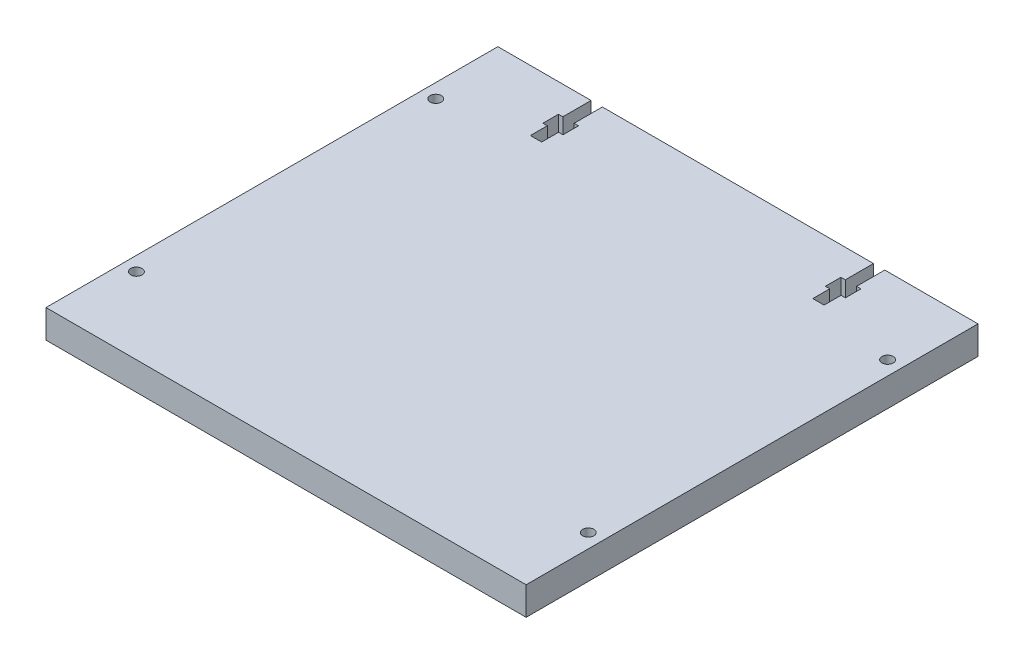
ISO-10303-21;
HEADER;
FILE_DESCRIPTION(('STEP AP214'),'2;1');
FILE_NAME('part.step','',(''),(''),'','','');
FILE_SCHEMA(('AUTOMOTIVE_DESIGN { 1 0 10303 214 1 1 1 1 }'));
ENDSEC;
DATA;
#1=APPLICATION_CONTEXT('core data for automotive mechanical design processes');
#2=APPLICATION_PROTOCOL_DEFINITION('international standard','automotive_design',2000,#1);
#3=PRODUCT_CONTEXT('',#1,'mechanical');
#4=PRODUCT('Part','Part','',(#3));
#5=PRODUCT_RELATED_PRODUCT_CATEGORY('part','',(#4));
#6=PRODUCT_DEFINITION_FORMATION('','',#4);
#7=PRODUCT_DEFINITION_CONTEXT('part definition',#1,'design');
#8=PRODUCT_DEFINITION('design','',#6,#7);
#9=PRODUCT_DEFINITION_SHAPE('','',#8);
#10=(LENGTH_UNIT() NAMED_UNIT(*) SI_UNIT(.MILLI.,.METRE.));
#11=(NAMED_UNIT(*) PLANE_ANGLE_UNIT() SI_UNIT($,.RADIAN.));
#12=(NAMED_UNIT(*) SI_UNIT($,.STERADIAN.) SOLID_ANGLE_UNIT());
#13=UNCERTAINTY_MEASURE_WITH_UNIT(LENGTH_MEASURE(1.E-05),#10,'distance_accuracy_value','');
#14=(GEOMETRIC_REPRESENTATION_CONTEXT(3) GLOBAL_UNCERTAINTY_ASSIGNED_CONTEXT((#13)) GLOBAL_UNIT_ASSIGNED_CONTEXT((#10,
#11,#12)) REPRESENTATION_CONTEXT('',''));
#15=CARTESIAN_POINT('',(0.,0.,0.));
#16=DIRECTION('',(0.,0.,1.));
#17=DIRECTION('',(1.,0.,0.));
#18=AXIS2_PLACEMENT_3D('',#15,#16,#17);
#19=CARTESIAN_POINT('',(0.,0.,160.));
#20=DIRECTION('',(0.,1.,0.));
#21=DIRECTION('',(0.,0.,1.));
#22=AXIS2_PLACEMENT_3D('',#19,#20,#21);
#23=PLANE('',#22);
#24=DIRECTION('',(1.,0.,0.));
#25=VECTOR('',#24,1.);
#26=CARTESIAN_POINT('',(0.,0.,10.));
#27=LINE('',#26,#25);
#28=CARTESIAN_POINT('',(137.,0.,10.));
#29=VERTEX_POINT('',#28);
#30=CARTESIAN_POINT('',(138.55,0.,10.));
#31=VERTEX_POINT('',#30);
#32=EDGE_CURVE('E291',#29,#31,#27,.T.);
#33=ORIENTED_EDGE('',*,*,#32,.F.);
#34=DIRECTION('',(0.,0.,1.));
#35=VECTOR('',#34,1.);
#36=CARTESIAN_POINT('',(137.,0.,0.));
#37=LINE('',#36,#35);
#38=CARTESIAN_POINT('',(137.,0.,0.));
#39=VERTEX_POINT('',#38);
#40=EDGE_CURVE('E288',#39,#29,#37,.T.);
#41=ORIENTED_EDGE('',*,*,#40,.F.);
#42=DIRECTION('',(1.,0.,0.));
#43=VECTOR('',#42,1.);
#44=CARTESIAN_POINT('',(0.,0.,0.));
#45=LINE('',#44,#43);
#46=CARTESIAN_POINT('',(170.,0.,0.));
#47=VERTEX_POINT('',#46);
#48=EDGE_CURVE('E437',#39,#47,#45,.T.);
#49=ORIENTED_EDGE('',*,*,#48,.T.);
#50=DIRECTION('',(0.,0.,-1.));
#51=VECTOR('',#50,1.);
#52=CARTESIAN_POINT('',(170.,0.,160.));
#53=LINE('',#52,#51);
#54=CARTESIAN_POINT('',(170.,0.,160.));
#55=VERTEX_POINT('',#54);
#56=EDGE_CURVE('E44',#55,#47,#53,.T.);
#57=ORIENTED_EDGE('',*,*,#56,.F.);
#58=DIRECTION('',(1.,0.,0.));
#59=VECTOR('',#58,1.);
#60=CARTESIAN_POINT('',(0.,0.,160.));
#61=LINE('',#60,#59);
#62=CARTESIAN_POINT('',(0.,0.,160.));
#63=VERTEX_POINT('',#62);
#64=EDGE_CURVE('E427',#63,#55,#61,.T.);
#65=ORIENTED_EDGE('',*,*,#64,.F.);
#66=DIRECTION('',(0.,0.,-1.));
#67=VECTOR('',#66,1.);
#68=CARTESIAN_POINT('',(0.,0.,160.));
#69=LINE('',#68,#67);
#70=CARTESIAN_POINT('',(0.,0.,0.));
#71=VERTEX_POINT('',#70);
#72=EDGE_CURVE('E11',#63,#71,#69,.T.);
#73=ORIENTED_EDGE('',*,*,#72,.T.);
#74=CARTESIAN_POINT('',(33.,0.,0.));
#75=VERTEX_POINT('',#74);
#76=EDGE_CURVE('E438',#71,#75,#45,.T.);
#77=ORIENTED_EDGE('',*,*,#76,.T.);
#78=DIRECTION('',(0.,0.,1.));
#79=VECTOR('',#78,1.);
#80=CARTESIAN_POINT('',(33.,0.,0.));
#81=LINE('',#80,#79);
#82=CARTESIAN_POINT('',(33.,0.,10.));
#83=VERTEX_POINT('',#82);
#84=EDGE_CURVE('E320',#75,#83,#81,.T.);
#85=ORIENTED_EDGE('',*,*,#84,.T.);
#86=DIRECTION('',(-1.,0.,0.));
#87=VECTOR('',#86,1.);
#88=CARTESIAN_POINT('',(0.,0.,10.));
#89=LINE('',#88,#87);
#90=CARTESIAN_POINT('',(31.45,0.,10.));
#91=VERTEX_POINT('',#90);
#92=EDGE_CURVE('E372',#83,#91,#89,.T.);
#93=ORIENTED_EDGE('',*,*,#92,.T.);
#94=DIRECTION('',(0.,0.,1.));
#95=VECTOR('',#94,1.);
#96=CARTESIAN_POINT('',(31.45,0.,0.));
#97=LINE('',#96,#95);
#98=CARTESIAN_POINT('',(31.45,0.,15.5));
#99=VERTEX_POINT('',#98);
#100=EDGE_CURVE('E369',#91,#99,#97,.T.);
#101=ORIENTED_EDGE('',*,*,#100,.T.);
#102=DIRECTION('',(1.,0.,0.));
#103=VECTOR('',#102,1.);
#104=CARTESIAN_POINT('',(0.,0.,15.5));
#105=LINE('',#104,#103);
#106=CARTESIAN_POINT('',(33.,0.,15.5));
#107=VERTEX_POINT('',#106);
#108=EDGE_CURVE('E366',#99,#107,#105,.T.);
#109=ORIENTED_EDGE('',*,*,#108,.T.);
#110=DIRECTION('',(0.,0.,1.));
#111=VECTOR('',#110,1.);
#112=CARTESIAN_POINT('',(33.,0.,0.));
#113=LINE('',#112,#111);
#114=CARTESIAN_POINT('',(33.,0.,21.5));
#115=VERTEX_POINT('',#114);
#116=EDGE_CURVE('E363',#107,#115,#113,.T.);
#117=ORIENTED_EDGE('',*,*,#116,.T.);
#118=DIRECTION('',(1.,0.,0.));
#119=VECTOR('',#118,1.);
#120=CARTESIAN_POINT('',(0.,0.,21.5));
#121=LINE('',#120,#119);
#122=CARTESIAN_POINT('',(37.,0.,21.5));
#123=VERTEX_POINT('',#122);
#124=EDGE_CURVE('E360',#115,#123,#121,.T.);
#125=ORIENTED_EDGE('',*,*,#124,.T.);
#126=DIRECTION('',(0.,0.,1.));
#127=VECTOR('',#126,1.);
#128=CARTESIAN_POINT('',(37.,0.,0.));
#129=LINE('',#128,#127);
#130=CARTESIAN_POINT('',(37.,0.,15.5));
#131=VERTEX_POINT('',#130);
#132=EDGE_CURVE('E357',#131,#123,#129,.T.);
#133=ORIENTED_EDGE('',*,*,#132,.F.);
#134=DIRECTION('',(-1.,0.,0.));
#135=VECTOR('',#134,1.);
#136=CARTESIAN_POINT('',(0.,0.,15.5));
#137=LINE('',#136,#135);
#138=CARTESIAN_POINT('',(38.55,0.,15.5));
#139=VERTEX_POINT('',#138);
#140=EDGE_CURVE('E354',#139,#131,#137,.T.);
#141=ORIENTED_EDGE('',*,*,#140,.F.);
#142=DIRECTION('',(0.,0.,1.));
#143=VECTOR('',#142,1.);
#144=CARTESIAN_POINT('',(38.55,0.,0.));
#145=LINE('',#144,#143);
#146=CARTESIAN_POINT('',(38.55,0.,10.));
#147=VERTEX_POINT('',#146);
#148=EDGE_CURVE('E351',#147,#139,#145,.T.);
#149=ORIENTED_EDGE('',*,*,#148,.F.);
#150=DIRECTION('',(1.,0.,0.));
#151=VECTOR('',#150,1.);
#152=CARTESIAN_POINT('',(0.,0.,10.));
#153=LINE('',#152,#151);
#154=CARTESIAN_POINT('',(37.,0.,10.));
#155=VERTEX_POINT('',#154);
#156=EDGE_CURVE('E348',#155,#147,#153,.T.);
#157=ORIENTED_EDGE('',*,*,#156,.F.);
#158=DIRECTION('',(0.,0.,1.));
#159=VECTOR('',#158,1.);
#160=CARTESIAN_POINT('',(37.,0.,0.));
#161=LINE('',#160,#159);
#162=CARTESIAN_POINT('',(37.,0.,0.));
#163=VERTEX_POINT('',#162);
#164=EDGE_CURVE('E345',#163,#155,#161,.T.);
#165=ORIENTED_EDGE('',*,*,#164,.F.);
#166=CARTESIAN_POINT('',(133.,0.,0.));
#167=VERTEX_POINT('',#166);
#168=EDGE_CURVE('E442',#163,#167,#45,.T.);
#169=ORIENTED_EDGE('',*,*,#168,.T.);
#170=DIRECTION('',(0.,0.,1.));
#171=VECTOR('',#170,1.);
#172=CARTESIAN_POINT('',(133.,0.,0.));
#173=LINE('',#172,#171);
#174=CARTESIAN_POINT('',(133.,0.,10.));
#175=VERTEX_POINT('',#174);
#176=EDGE_CURVE('E51',#167,#175,#173,.T.);
#177=ORIENTED_EDGE('',*,*,#176,.T.);
#178=DIRECTION('',(-1.,0.,0.));
#179=VECTOR('',#178,1.);
#180=CARTESIAN_POINT('',(0.,0.,10.));
#181=LINE('',#180,#179);
#182=CARTESIAN_POINT('',(131.45,0.,10.));
#183=VERTEX_POINT('',#182);
#184=EDGE_CURVE('E284',#175,#183,#181,.T.);
#185=ORIENTED_EDGE('',*,*,#184,.T.);
#186=DIRECTION('',(0.,0.,1.));
#187=VECTOR('',#186,1.);
#188=CARTESIAN_POINT('',(131.45,0.,0.));
#189=LINE('',#188,#187);
#190=CARTESIAN_POINT('',(131.45,0.,15.5));
#191=VERTEX_POINT('',#190);
#192=EDGE_CURVE('E281',#183,#191,#189,.T.);
#193=ORIENTED_EDGE('',*,*,#192,.T.);
#194=DIRECTION('',(1.,0.,0.));
#195=VECTOR('',#194,1.);
#196=CARTESIAN_POINT('',(0.,0.,15.4999999999999));
#197=LINE('',#196,#195);
#198=CARTESIAN_POINT('',(133.,0.,15.5));
#199=VERTEX_POINT('',#198);
#200=EDGE_CURVE('E278',#191,#199,#197,.T.);
#201=ORIENTED_EDGE('',*,*,#200,.T.);
#202=DIRECTION('',(0.,0.,1.));
#203=VECTOR('',#202,1.);
#204=CARTESIAN_POINT('',(133.,0.,0.));
#205=LINE('',#204,#203);
#206=CARTESIAN_POINT('',(133.,0.,21.5));
#207=VERTEX_POINT('',#206);
#208=EDGE_CURVE('E275',#199,#207,#205,.T.);
#209=ORIENTED_EDGE('',*,*,#208,.T.);
#210=DIRECTION('',(-1.,0.,0.));
#211=VECTOR('',#210,1.);
#212=CARTESIAN_POINT('',(0.,0.,21.5));
#213=LINE('',#212,#211);
#214=CARTESIAN_POINT('',(137.,0.,21.5));
#215=VERTEX_POINT('',#214);
#216=EDGE_CURVE('E272',#215,#207,#213,.T.);
#217=ORIENTED_EDGE('',*,*,#216,.F.);
#218=DIRECTION('',(0.,0.,1.));
#219=VECTOR('',#218,1.);
#220=CARTESIAN_POINT('',(137.,0.,0.));
#221=LINE('',#220,#219);
#222=CARTESIAN_POINT('',(137.,0.,15.5));
#223=VERTEX_POINT('',#222);
#224=EDGE_CURVE('E228',#223,#215,#221,.T.);
#225=ORIENTED_EDGE('',*,*,#224,.F.);
#226=DIRECTION('',(-1.,0.,0.));
#227=VECTOR('',#226,1.);
#228=CARTESIAN_POINT('',(0.,0.,15.5));
#229=LINE('',#228,#227);
#230=CARTESIAN_POINT('',(138.55,0.,15.5));
#231=VERTEX_POINT('',#230);
#232=EDGE_CURVE('E247',#231,#223,#229,.T.);
#233=ORIENTED_EDGE('',*,*,#232,.F.);
#234=DIRECTION('',(0.,0.,1.));
#235=VECTOR('',#234,1.);
#236=CARTESIAN_POINT('',(138.55,0.,0.));
#237=LINE('',#236,#235);
#238=EDGE_CURVE('E250',#31,#231,#237,.T.);
#239=ORIENTED_EDGE('',*,*,#238,.F.);
#240=EDGE_LOOP('',(#33,#41,#49,#57,#65,#73,#77,#85,#93,#101,#109,#117,#125,#133,#141,#149,#157,
#165,#169,#177,#185,#193,#201,#209,#217,#225,#233,#239));
#241=FACE_BOUND('',#240,.T.);
#242=CARTESIAN_POINT('',(165.,0.,133.));
#243=DIRECTION('',(0.,1.,0.));
#244=DIRECTION('',(0.,0.,1.));
#245=AXIS2_PLACEMENT_3D('',#242,#243,#244);
#246=CIRCLE('',#245,2.);
#247=CARTESIAN_POINT('',(165.,0.,135.));
#248=VERTEX_POINT('',#247);
#249=EDGE_CURVE('E413',#248,#248,#246,.T.);
#250=ORIENTED_EDGE('',*,*,#249,.T.);
#251=EDGE_LOOP('',(#250));
#252=FACE_BOUND('',#251,.T.);
#253=CARTESIAN_POINT('',(5.,0.,27.));
#254=DIRECTION('',(0.,1.,0.));
#255=DIRECTION('',(0.,0.,1.));
#256=AXIS2_PLACEMENT_3D('',#253,#254,#255);
#257=CIRCLE('',#256,2.);
#258=CARTESIAN_POINT('',(5.,0.,29.));
#259=VERTEX_POINT('',#258);
#260=EDGE_CURVE('E400',#259,#259,#257,.T.);
#261=ORIENTED_EDGE('',*,*,#260,.T.);
#262=EDGE_LOOP('',(#261));
#263=FACE_BOUND('',#262,.T.);
#264=CARTESIAN_POINT('',(5.,0.,133.));
#265=DIRECTION('',(0.,-1.,0.));
#266=DIRECTION('',(0.,0.,-1.));
#267=AXIS2_PLACEMENT_3D('',#264,#265,#266);
#268=CIRCLE('',#267,2.);
#269=CARTESIAN_POINT('',(5.,0.,131.));
#270=VERTEX_POINT('',#269);
#271=EDGE_CURVE('E403',#270,#270,#268,.T.);
#272=ORIENTED_EDGE('',*,*,#271,.F.);
#273=EDGE_LOOP('',(#272));
#274=FACE_BOUND('',#273,.T.);
#275=CARTESIAN_POINT('',(165.,0.,27.));
#276=DIRECTION('',(0.,-1.,0.));
#277=DIRECTION('',(0.,0.,-1.));
#278=AXIS2_PLACEMENT_3D('',#275,#276,#277);
#279=CIRCLE('',#278,2.);
#280=CARTESIAN_POINT('',(165.,0.,25.));
#281=VERTEX_POINT('',#280);
#282=EDGE_CURVE('E407',#281,#281,#279,.T.);
#283=ORIENTED_EDGE('',*,*,#282,.F.);
#284=EDGE_LOOP('',(#283));
#285=FACE_BOUND('',#284,.T.);
#286=ADVANCED_FACE('F36',(#241,#252,#263,#274,#285),#23,.F.);
#287=CARTESIAN_POINT('',(0.,10.,160.));
#288=DIRECTION('',(0.,-1.,0.));
#289=DIRECTION('',(0.,0.,-1.));
#290=AXIS2_PLACEMENT_3D('',#287,#288,#289);
#291=PLANE('',#290);
#292=CARTESIAN_POINT('',(165.,10.,133.));
#293=DIRECTION('',(0.,1.,0.));
#294=DIRECTION('',(0.,0.,1.));
#295=AXIS2_PLACEMENT_3D('',#292,#293,#294);
#296=CIRCLE('',#295,2.);
#297=CARTESIAN_POINT('',(165.,10.,135.));
#298=VERTEX_POINT('',#297);
#299=EDGE_CURVE('E298',#298,#298,#296,.T.);
#300=ORIENTED_EDGE('',*,*,#299,.F.);
#301=EDGE_LOOP('',(#300));
#302=FACE_BOUND('',#301,.T.);
#303=CARTESIAN_POINT('',(5.,10.,27.));
#304=DIRECTION('',(0.,1.,0.));
#305=DIRECTION('',(0.,0.,1.));
#306=AXIS2_PLACEMENT_3D('',#303,#304,#305);
#307=CIRCLE('',#306,2.);
#308=CARTESIAN_POINT('',(5.,10.,29.));
#309=VERTEX_POINT('',#308);
#310=EDGE_CURVE('E404',#309,#309,#307,.T.);
#311=ORIENTED_EDGE('',*,*,#310,.F.);
#312=EDGE_LOOP('',(#311));
#313=FACE_BOUND('',#312,.T.);
#314=CARTESIAN_POINT('',(5.,10.,133.));
#315=DIRECTION('',(0.,-1.,0.));
#316=DIRECTION('',(0.,0.,-1.));
#317=AXIS2_PLACEMENT_3D('',#314,#315,#316);
#318=CIRCLE('',#317,2.);
#319=CARTESIAN_POINT('',(5.,10.,131.));
#320=VERTEX_POINT('',#319);
#321=EDGE_CURVE('E418',#320,#320,#318,.T.);
#322=ORIENTED_EDGE('',*,*,#321,.T.);
#323=EDGE_LOOP('',(#322));
#324=FACE_BOUND('',#323,.T.);
#325=CARTESIAN_POINT('',(165.,10.,27.));
#326=DIRECTION('',(0.,-1.,0.));
#327=DIRECTION('',(0.,0.,-1.));
#328=AXIS2_PLACEMENT_3D('',#325,#326,#327);
#329=CIRCLE('',#328,2.);
#330=CARTESIAN_POINT('',(165.,10.,25.));
#331=VERTEX_POINT('',#330);
#332=EDGE_CURVE('E410',#331,#331,#329,.T.);
#333=ORIENTED_EDGE('',*,*,#332,.T.);
#334=EDGE_LOOP('',(#333));
#335=FACE_BOUND('',#334,.T.);
#336=DIRECTION('',(-1.,0.,0.));
#337=VECTOR('',#336,1.);
#338=CARTESIAN_POINT('',(0.,10.,0.));
#339=LINE('',#338,#337);
#340=CARTESIAN_POINT('',(170.,10.,0.));
#341=VERTEX_POINT('',#340);
#342=CARTESIAN_POINT('',(137.,10.,0.));
#343=VERTEX_POINT('',#342);
#344=EDGE_CURVE('E428',#341,#343,#339,.T.);
#345=ORIENTED_EDGE('',*,*,#344,.T.);
#346=DIRECTION('',(0.,0.,1.));
#347=VECTOR('',#346,1.);
#348=CARTESIAN_POINT('',(137.,10.,0.));
#349=LINE('',#348,#347);
#350=CARTESIAN_POINT('',(137.,10.,10.));
#351=VERTEX_POINT('',#350);
#352=EDGE_CURVE('E262',#343,#351,#349,.T.);
#353=ORIENTED_EDGE('',*,*,#352,.T.);
#354=DIRECTION('',(1.,0.,0.));
#355=VECTOR('',#354,1.);
#356=CARTESIAN_POINT('',(0.,10.,10.));
#357=LINE('',#356,#355);
#358=CARTESIAN_POINT('',(138.55,10.,10.));
#359=VERTEX_POINT('',#358);
#360=EDGE_CURVE('E265',#351,#359,#357,.T.);
#361=ORIENTED_EDGE('',*,*,#360,.T.);
#362=DIRECTION('',(0.,0.,1.));
#363=VECTOR('',#362,1.);
#364=CARTESIAN_POINT('',(138.55,10.,0.));
#365=LINE('',#364,#363);
#366=CARTESIAN_POINT('',(138.55,10.,15.5));
#367=VERTEX_POINT('',#366);
#368=EDGE_CURVE('E268',#359,#367,#365,.T.);
#369=ORIENTED_EDGE('',*,*,#368,.T.);
#370=DIRECTION('',(-1.,0.,0.));
#371=VECTOR('',#370,1.);
#372=CARTESIAN_POINT('',(0.,10.,15.5));
#373=LINE('',#372,#371);
#374=CARTESIAN_POINT('',(137.,10.,15.5));
#375=VERTEX_POINT('',#374);
#376=EDGE_CURVE('E233',#367,#375,#373,.T.);
#377=ORIENTED_EDGE('',*,*,#376,.T.);
#378=DIRECTION('',(0.,0.,1.));
#379=VECTOR('',#378,1.);
#380=CARTESIAN_POINT('',(137.,10.,0.));
#381=LINE('',#380,#379);
#382=CARTESIAN_POINT('',(137.,10.,21.5));
#383=VERTEX_POINT('',#382);
#384=EDGE_CURVE('E225',#375,#383,#381,.T.);
#385=ORIENTED_EDGE('',*,*,#384,.T.);
#386=DIRECTION('',(-1.,0.,0.));
#387=VECTOR('',#386,1.);
#388=CARTESIAN_POINT('',(0.,10.,21.5));
#389=LINE('',#388,#387);
#390=CARTESIAN_POINT('',(133.,10.,21.5));
#391=VERTEX_POINT('',#390);
#392=EDGE_CURVE('E237',#383,#391,#389,.T.);
#393=ORIENTED_EDGE('',*,*,#392,.T.);
#394=DIRECTION('',(0.,0.,1.));
#395=VECTOR('',#394,1.);
#396=CARTESIAN_POINT('',(133.,10.,0.));
#397=LINE('',#396,#395);
#398=CARTESIAN_POINT('',(133.,10.,15.5));
#399=VERTEX_POINT('',#398);
#400=EDGE_CURVE('E241',#399,#391,#397,.T.);
#401=ORIENTED_EDGE('',*,*,#400,.F.);
#402=DIRECTION('',(1.,0.,0.));
#403=VECTOR('',#402,1.);
#404=CARTESIAN_POINT('',(0.,10.,15.4999999999999));
#405=LINE('',#404,#403);
#406=CARTESIAN_POINT('',(131.45,10.,15.5));
#407=VERTEX_POINT('',#406);
#408=EDGE_CURVE('E254',#407,#399,#405,.T.);
#409=ORIENTED_EDGE('',*,*,#408,.F.);
#410=DIRECTION('',(0.,0.,1.));
#411=VECTOR('',#410,1.);
#412=CARTESIAN_POINT('',(131.45,10.,0.));
#413=LINE('',#412,#411);
#414=CARTESIAN_POINT('',(131.45,10.,10.));
#415=VERTEX_POINT('',#414);
#416=EDGE_CURVE('E256',#415,#407,#413,.T.);
#417=ORIENTED_EDGE('',*,*,#416,.F.);
#418=DIRECTION('',(-1.,0.,0.));
#419=VECTOR('',#418,1.);
#420=CARTESIAN_POINT('',(0.,10.,10.));
#421=LINE('',#420,#419);
#422=CARTESIAN_POINT('',(133.,10.,10.));
#423=VERTEX_POINT('',#422);
#424=EDGE_CURVE('E258',#423,#415,#421,.T.);
#425=ORIENTED_EDGE('',*,*,#424,.F.);
#426=DIRECTION('',(0.,0.,1.));
#427=VECTOR('',#426,1.);
#428=CARTESIAN_POINT('',(133.,10.,0.));
#429=LINE('',#428,#427);
#430=CARTESIAN_POINT('',(133.,10.,0.));
#431=VERTEX_POINT('',#430);
#432=EDGE_CURVE('E260',#431,#423,#429,.T.);
#433=ORIENTED_EDGE('',*,*,#432,.F.);
#434=CARTESIAN_POINT('',(37.,10.,0.));
#435=VERTEX_POINT('',#434);
#436=EDGE_CURVE('E446',#431,#435,#339,.T.);
#437=ORIENTED_EDGE('',*,*,#436,.T.);
#438=DIRECTION('',(0.,0.,1.));
#439=VECTOR('',#438,1.);
#440=CARTESIAN_POINT('',(37.,10.,0.));
#441=LINE('',#440,#439);
#442=CARTESIAN_POINT('',(37.,10.,10.));
#443=VERTEX_POINT('',#442);
#444=EDGE_CURVE('E59',#435,#443,#441,.T.);
#445=ORIENTED_EDGE('',*,*,#444,.T.);
#446=DIRECTION('',(1.,0.,0.));
#447=VECTOR('',#446,1.);
#448=CARTESIAN_POINT('',(0.,10.,10.));
#449=LINE('',#448,#447);
#450=CARTESIAN_POINT('',(38.55,10.,10.));
#451=VERTEX_POINT('',#450);
#452=EDGE_CURVE('E319',#443,#451,#449,.T.);
#453=ORIENTED_EDGE('',*,*,#452,.T.);
#454=DIRECTION('',(0.,0.,1.));
#455=VECTOR('',#454,1.);
#456=CARTESIAN_POINT('',(38.55,10.,0.));
#457=LINE('',#456,#455);
#458=CARTESIAN_POINT('',(38.55,10.,15.5));
#459=VERTEX_POINT('',#458);
#460=EDGE_CURVE('E323',#451,#459,#457,.T.);
#461=ORIENTED_EDGE('',*,*,#460,.T.);
#462=DIRECTION('',(-1.,0.,0.));
#463=VECTOR('',#462,1.);
#464=CARTESIAN_POINT('',(0.,10.,15.5));
#465=LINE('',#464,#463);
#466=CARTESIAN_POINT('',(37.,10.,15.5));
#467=VERTEX_POINT('',#466);
#468=EDGE_CURVE('E326',#459,#467,#465,.T.);
#469=ORIENTED_EDGE('',*,*,#468,.T.);
#470=DIRECTION('',(0.,0.,1.));
#471=VECTOR('',#470,1.);
#472=CARTESIAN_POINT('',(37.,10.,0.));
#473=LINE('',#472,#471);
#474=CARTESIAN_POINT('',(37.,10.,21.5));
#475=VERTEX_POINT('',#474);
#476=EDGE_CURVE('E329',#467,#475,#473,.T.);
#477=ORIENTED_EDGE('',*,*,#476,.T.);
#478=DIRECTION('',(1.,0.,0.));
#479=VECTOR('',#478,1.);
#480=CARTESIAN_POINT('',(0.,10.,21.5));
#481=LINE('',#480,#479);
#482=CARTESIAN_POINT('',(33.,10.,21.5));
#483=VERTEX_POINT('',#482);
#484=EDGE_CURVE('E332',#483,#475,#481,.T.);
#485=ORIENTED_EDGE('',*,*,#484,.F.);
#486=DIRECTION('',(0.,0.,1.));
#487=VECTOR('',#486,1.);
#488=CARTESIAN_POINT('',(33.,10.,0.));
#489=LINE('',#488,#487);
#490=CARTESIAN_POINT('',(33.,10.,15.5));
#491=VERTEX_POINT('',#490);
#492=EDGE_CURVE('E334',#491,#483,#489,.T.);
#493=ORIENTED_EDGE('',*,*,#492,.F.);
#494=DIRECTION('',(1.,0.,0.));
#495=VECTOR('',#494,1.);
#496=CARTESIAN_POINT('',(0.,10.,15.5));
#497=LINE('',#496,#495);
#498=CARTESIAN_POINT('',(31.45,10.,15.5));
#499=VERTEX_POINT('',#498);
#500=EDGE_CURVE('E336',#499,#491,#497,.T.);
#501=ORIENTED_EDGE('',*,*,#500,.F.);
#502=DIRECTION('',(0.,0.,1.));
#503=VECTOR('',#502,1.);
#504=CARTESIAN_POINT('',(31.45,10.,0.));
#505=LINE('',#504,#503);
#506=CARTESIAN_POINT('',(31.45,10.,10.));
#507=VERTEX_POINT('',#506);
#508=EDGE_CURVE('E338',#507,#499,#505,.T.);
#509=ORIENTED_EDGE('',*,*,#508,.F.);
#510=DIRECTION('',(-1.,0.,0.));
#511=VECTOR('',#510,1.);
#512=CARTESIAN_POINT('',(0.,10.,10.));
#513=LINE('',#512,#511);
#514=CARTESIAN_POINT('',(33.,10.,10.));
#515=VERTEX_POINT('',#514);
#516=EDGE_CURVE('E340',#515,#507,#513,.T.);
#517=ORIENTED_EDGE('',*,*,#516,.F.);
#518=DIRECTION('',(0.,0.,1.));
#519=VECTOR('',#518,1.);
#520=CARTESIAN_POINT('',(33.,10.,0.));
#521=LINE('',#520,#519);
#522=CARTESIAN_POINT('',(33.,10.,0.));
#523=VERTEX_POINT('',#522);
#524=EDGE_CURVE('E342',#523,#515,#521,.T.);
#525=ORIENTED_EDGE('',*,*,#524,.F.);
#526=CARTESIAN_POINT('',(0.,10.,0.));
#527=VERTEX_POINT('',#526);
#528=EDGE_CURVE('E444',#523,#527,#339,.T.);
#529=ORIENTED_EDGE('',*,*,#528,.T.);
#530=DIRECTION('',(0.,0.,-1.));
#531=VECTOR('',#530,1.);
#532=CARTESIAN_POINT('',(0.,10.,160.));
#533=LINE('',#532,#531);
#534=CARTESIAN_POINT('',(0.,10.,160.));
#535=VERTEX_POINT('',#534);
#536=EDGE_CURVE('E434',#535,#527,#533,.T.);
#537=ORIENTED_EDGE('',*,*,#536,.F.);
#538=DIRECTION('',(-1.,0.,0.));
#539=VECTOR('',#538,1.);
#540=CARTESIAN_POINT('',(0.,10.,160.));
#541=LINE('',#540,#539);
#542=CARTESIAN_POINT('',(170.,10.,160.));
#543=VERTEX_POINT('',#542);
#544=EDGE_CURVE('E432',#543,#535,#541,.T.);
#545=ORIENTED_EDGE('',*,*,#544,.F.);
#546=DIRECTION('',(0.,0.,-1.));
#547=VECTOR('',#546,1.);
#548=CARTESIAN_POINT('',(170.,10.,160.));
#549=LINE('',#548,#547);
#550=EDGE_CURVE('E449',#543,#341,#549,.T.);
#551=ORIENTED_EDGE('',*,*,#550,.T.);
#552=EDGE_LOOP('',(#345,#353,#361,#369,#377,#385,#393,#401,#409,#417,#425,#433,#437,#445,#453,
#461,#469,#477,#485,#493,#501,#509,#517,#525,#529,#537,#545,#551));
#553=FACE_BOUND('',#552,.T.);
#554=ADVANCED_FACE('F244',(#302,#313,#324,#335,#553),#291,.F.);
#555=CARTESIAN_POINT('',(0.,0.,0.));
#556=DIRECTION('',(0.,0.,-1.));
#557=DIRECTION('',(-1.,0.,0.));
#558=AXIS2_PLACEMENT_3D('',#555,#556,#557);
#559=PLANE('',#558);
#560=ORIENTED_EDGE('',*,*,#436,.F.);
#561=DIRECTION('',(0.,-1.,0.));
#562=VECTOR('',#561,1.);
#563=CARTESIAN_POINT('',(133.,10.,0.));
#564=LINE('',#563,#562);
#565=EDGE_CURVE('E307',#431,#167,#564,.T.);
#566=ORIENTED_EDGE('',*,*,#565,.T.);
#567=ORIENTED_EDGE('',*,*,#168,.F.);
#568=DIRECTION('',(0.,-1.,0.));
#569=VECTOR('',#568,1.);
#570=CARTESIAN_POINT('',(37.,10.,0.));
#571=LINE('',#570,#569);
#572=EDGE_CURVE('E344',#435,#163,#571,.T.);
#573=ORIENTED_EDGE('',*,*,#572,.F.);
#574=EDGE_LOOP('',(#560,#566,#567,#573));
#575=FACE_BOUND('',#574,.T.);
#576=ADVANCED_FACE('F529',(#575),#559,.T.);
#577=ORIENTED_EDGE('',*,*,#528,.F.);
#578=DIRECTION('',(0.,-1.,0.));
#579=VECTOR('',#578,1.);
#580=CARTESIAN_POINT('',(33.,10.,0.));
#581=LINE('',#580,#579);
#582=EDGE_CURVE('E273',#523,#75,#581,.T.);
#583=ORIENTED_EDGE('',*,*,#582,.T.);
#584=ORIENTED_EDGE('',*,*,#76,.F.);
#585=DIRECTION('',(0.,-1.,0.));
#586=VECTOR('',#585,1.);
#587=CARTESIAN_POINT('',(0.,0.,0.));
#588=LINE('',#587,#586);
#589=EDGE_CURVE('E421',#527,#71,#588,.T.);
#590=ORIENTED_EDGE('',*,*,#589,.F.);
#591=EDGE_LOOP('',(#577,#583,#584,#590));
#592=FACE_BOUND('',#591,.T.);
#593=ADVANCED_FACE('F476',(#592),#559,.T.);
#594=CARTESIAN_POINT('',(0.,0.,160.));
#595=DIRECTION('',(1.,0.,0.));
#596=DIRECTION('',(0.,0.,-1.));
#597=AXIS2_PLACEMENT_3D('',#594,#595,#596);
#598=PLANE('',#597);
#599=ORIENTED_EDGE('',*,*,#589,.T.);
#600=ORIENTED_EDGE('',*,*,#72,.F.);
#601=DIRECTION('',(0.,-1.,0.));
#602=VECTOR('',#601,1.);
#603=CARTESIAN_POINT('',(0.,0.,160.));
#604=LINE('',#603,#602);
#605=EDGE_CURVE('E424',#535,#63,#604,.T.);
#606=ORIENTED_EDGE('',*,*,#605,.F.);
#607=ORIENTED_EDGE('',*,*,#536,.T.);
#608=EDGE_LOOP('',(#599,#600,#606,#607));
#609=FACE_BOUND('',#608,.T.);
#610=ADVANCED_FACE('F38',(#609),#598,.F.);
#611=CARTESIAN_POINT('',(170.,0.,160.));
#612=DIRECTION('',(-1.,0.,0.));
#613=DIRECTION('',(0.,0.,1.));
#614=AXIS2_PLACEMENT_3D('',#611,#612,#613);
#615=PLANE('',#614);
#616=DIRECTION('',(0.,1.,0.));
#617=VECTOR('',#616,1.);
#618=CARTESIAN_POINT('',(170.,0.,0.));
#619=LINE('',#618,#617);
#620=EDGE_CURVE('E441',#47,#341,#619,.T.);
#621=ORIENTED_EDGE('',*,*,#620,.T.);
#622=ORIENTED_EDGE('',*,*,#550,.F.);
#623=DIRECTION('',(0.,1.,0.));
#624=VECTOR('',#623,1.);
#625=CARTESIAN_POINT('',(170.,0.,160.));
#626=LINE('',#625,#624);
#627=EDGE_CURVE('E430',#55,#543,#626,.T.);
#628=ORIENTED_EDGE('',*,*,#627,.F.);
#629=ORIENTED_EDGE('',*,*,#56,.T.);
#630=EDGE_LOOP('',(#621,#622,#628,#629));
#631=FACE_BOUND('',#630,.T.);
#632=ADVANCED_FACE('F456',(#631),#615,.F.);
#633=CARTESIAN_POINT('',(0.,0.,160.));
#634=DIRECTION('',(0.,0.,-1.));
#635=DIRECTION('',(-1.,0.,0.));
#636=AXIS2_PLACEMENT_3D('',#633,#634,#635);
#637=PLANE('',#636);
#638=ORIENTED_EDGE('',*,*,#605,.T.);
#639=ORIENTED_EDGE('',*,*,#64,.T.);
#640=ORIENTED_EDGE('',*,*,#627,.T.);
#641=ORIENTED_EDGE('',*,*,#544,.T.);
#642=EDGE_LOOP('',(#638,#639,#640,#641));
#643=FACE_BOUND('',#642,.T.);
#644=ADVANCED_FACE('F468',(#643),#637,.F.);
#645=DIRECTION('',(0.,-1.,0.));
#646=VECTOR('',#645,1.);
#647=CARTESIAN_POINT('',(137.,10.,0.));
#648=LINE('',#647,#646);
#649=EDGE_CURVE('E305',#343,#39,#648,.T.);
#650=ORIENTED_EDGE('',*,*,#649,.F.);
#651=ORIENTED_EDGE('',*,*,#344,.F.);
#652=ORIENTED_EDGE('',*,*,#620,.F.);
#653=ORIENTED_EDGE('',*,*,#48,.F.);
#654=EDGE_LOOP('',(#650,#651,#652,#653));
#655=FACE_BOUND('',#654,.T.);
#656=ADVANCED_FACE('F463',(#655),#559,.T.);
#657=CARTESIAN_POINT('',(5.,10.,133.));
#658=DIRECTION('',(0.,-1.,0.));
#659=DIRECTION('',(0.,0.,-1.));
#660=AXIS2_PLACEMENT_3D('',#657,#658,#659);
#661=CYLINDRICAL_SURFACE('',#660,2.);
#662=ORIENTED_EDGE('',*,*,#321,.F.);
#663=EDGE_LOOP('',(#662));
#664=FACE_BOUND('',#663,.T.);
#665=ORIENTED_EDGE('',*,*,#271,.T.);
#666=EDGE_LOOP('',(#665));
#667=FACE_BOUND('',#666,.T.);
#668=ADVANCED_FACE('F583',(#664,#667),#661,.F.);
#669=CARTESIAN_POINT('',(5.,10.,27.));
#670=DIRECTION('',(0.,-1.,0.));
#671=DIRECTION('',(0.,0.,-1.));
#672=AXIS2_PLACEMENT_3D('',#669,#670,#671);
#673=CYLINDRICAL_SURFACE('',#672,2.);
#674=ORIENTED_EDGE('',*,*,#310,.T.);
#675=EDGE_LOOP('',(#674));
#676=FACE_BOUND('',#675,.T.);
#677=ORIENTED_EDGE('',*,*,#260,.F.);
#678=EDGE_LOOP('',(#677));
#679=FACE_BOUND('',#678,.T.);
#680=ADVANCED_FACE('F588',(#676,#679),#673,.F.);
#681=CARTESIAN_POINT('',(165.,10.,27.));
#682=DIRECTION('',(0.,-1.,0.));
#683=DIRECTION('',(0.,0.,-1.));
#684=AXIS2_PLACEMENT_3D('',#681,#682,#683);
#685=CYLINDRICAL_SURFACE('',#684,2.);
#686=ORIENTED_EDGE('',*,*,#332,.F.);
#687=EDGE_LOOP('',(#686));
#688=FACE_BOUND('',#687,.T.);
#689=ORIENTED_EDGE('',*,*,#282,.T.);
#690=EDGE_LOOP('',(#689));
#691=FACE_BOUND('',#690,.T.);
#692=ADVANCED_FACE('F593',(#688,#691),#685,.F.);
#693=CARTESIAN_POINT('',(165.,10.,133.));
#694=DIRECTION('',(0.,-1.,0.));
#695=DIRECTION('',(0.,0.,-1.));
#696=AXIS2_PLACEMENT_3D('',#693,#694,#695);
#697=CYLINDRICAL_SURFACE('',#696,2.);
#698=ORIENTED_EDGE('',*,*,#299,.T.);
#699=EDGE_LOOP('',(#698));
#700=FACE_BOUND('',#699,.T.);
#701=ORIENTED_EDGE('',*,*,#249,.F.);
#702=EDGE_LOOP('',(#701));
#703=FACE_BOUND('',#702,.T.);
#704=ADVANCED_FACE('F590',(#700,#703),#697,.F.);
#705=CARTESIAN_POINT('',(33.,10.,0.));
#706=DIRECTION('',(1.,0.,0.));
#707=DIRECTION('',(0.,0.,-1.));
#708=AXIS2_PLACEMENT_3D('',#705,#706,#707);
#709=PLANE('',#708);
#710=ORIENTED_EDGE('',*,*,#84,.F.);
#711=ORIENTED_EDGE('',*,*,#582,.F.);
#712=ORIENTED_EDGE('',*,*,#524,.T.);
#713=DIRECTION('',(0.,-1.,0.));
#714=VECTOR('',#713,1.);
#715=CARTESIAN_POINT('',(33.,10.,10.));
#716=LINE('',#715,#714);
#717=EDGE_CURVE('E379',#515,#83,#716,.T.);
#718=ORIENTED_EDGE('',*,*,#717,.T.);
#719=EDGE_LOOP('',(#710,#711,#712,#718));
#720=FACE_BOUND('',#719,.T.);
#721=ADVANCED_FACE('F479',(#720),#709,.T.);
#722=CARTESIAN_POINT('',(0.,10.,10.));
#723=DIRECTION('',(0.,0.,1.));
#724=DIRECTION('',(1.,0.,0.));
#725=AXIS2_PLACEMENT_3D('',#722,#723,#724);
#726=PLANE('',#725);
#727=ORIENTED_EDGE('',*,*,#92,.F.);
#728=ORIENTED_EDGE('',*,*,#717,.F.);
#729=ORIENTED_EDGE('',*,*,#516,.T.);
#730=DIRECTION('',(0.,-1.,0.));
#731=VECTOR('',#730,1.);
#732=CARTESIAN_POINT('',(31.45,10.,10.));
#733=LINE('',#732,#731);
#734=EDGE_CURVE('E381',#507,#91,#733,.T.);
#735=ORIENTED_EDGE('',*,*,#734,.T.);
#736=EDGE_LOOP('',(#727,#728,#729,#735));
#737=FACE_BOUND('',#736,.T.);
#738=ADVANCED_FACE('F487',(#737),#726,.T.);
#739=CARTESIAN_POINT('',(31.45,10.,0.));
#740=DIRECTION('',(1.,0.,0.));
#741=DIRECTION('',(0.,0.,-1.));
#742=AXIS2_PLACEMENT_3D('',#739,#740,#741);
#743=PLANE('',#742);
#744=ORIENTED_EDGE('',*,*,#100,.F.);
#745=ORIENTED_EDGE('',*,*,#734,.F.);
#746=ORIENTED_EDGE('',*,*,#508,.T.);
#747=DIRECTION('',(0.,-1.,0.));
#748=VECTOR('',#747,1.);
#749=CARTESIAN_POINT('',(31.45,10.,15.5));
#750=LINE('',#749,#748);
#751=EDGE_CURVE('E383',#499,#99,#750,.T.);
#752=ORIENTED_EDGE('',*,*,#751,.T.);
#753=EDGE_LOOP('',(#744,#745,#746,#752));
#754=FACE_BOUND('',#753,.T.);
#755=ADVANCED_FACE('F490',(#754),#743,.T.);
#756=CARTESIAN_POINT('',(0.,10.,15.5));
#757=DIRECTION('',(0.,0.,-1.));
#758=DIRECTION('',(-1.,0.,0.));
#759=AXIS2_PLACEMENT_3D('',#756,#757,#758);
#760=PLANE('',#759);
#761=ORIENTED_EDGE('',*,*,#108,.F.);
#762=ORIENTED_EDGE('',*,*,#751,.F.);
#763=ORIENTED_EDGE('',*,*,#500,.T.);
#764=DIRECTION('',(0.,-1.,0.));
#765=VECTOR('',#764,1.);
#766=CARTESIAN_POINT('',(33.,10.,15.5));
#767=LINE('',#766,#765);
#768=EDGE_CURVE('E385',#491,#107,#767,.T.);
#769=ORIENTED_EDGE('',*,*,#768,.T.);
#770=EDGE_LOOP('',(#761,#762,#763,#769));
#771=FACE_BOUND('',#770,.T.);
#772=ADVANCED_FACE('F495',(#771),#760,.T.);
#773=CARTESIAN_POINT('',(33.,10.,0.));
#774=DIRECTION('',(1.,0.,0.));
#775=DIRECTION('',(0.,0.,-1.));
#776=AXIS2_PLACEMENT_3D('',#773,#774,#775);
#777=PLANE('',#776);
#778=ORIENTED_EDGE('',*,*,#116,.F.);
#779=ORIENTED_EDGE('',*,*,#768,.F.);
#780=ORIENTED_EDGE('',*,*,#492,.T.);
#781=DIRECTION('',(0.,-1.,0.));
#782=VECTOR('',#781,1.);
#783=CARTESIAN_POINT('',(33.,10.,21.5));
#784=LINE('',#783,#782);
#785=EDGE_CURVE('E387',#483,#115,#784,.T.);
#786=ORIENTED_EDGE('',*,*,#785,.T.);
#787=EDGE_LOOP('',(#778,#779,#780,#786));
#788=FACE_BOUND('',#787,.T.);
#789=ADVANCED_FACE('F499',(#788),#777,.T.);
#790=CARTESIAN_POINT('',(0.,10.,21.5));
#791=DIRECTION('',(0.,0.,-1.));
#792=DIRECTION('',(-1.,0.,0.));
#793=AXIS2_PLACEMENT_3D('',#790,#791,#792);
#794=PLANE('',#793);
#795=ORIENTED_EDGE('',*,*,#124,.F.);
#796=ORIENTED_EDGE('',*,*,#785,.F.);
#797=ORIENTED_EDGE('',*,*,#484,.T.);
#798=DIRECTION('',(0.,-1.,0.));
#799=VECTOR('',#798,1.);
#800=CARTESIAN_POINT('',(37.,10.,21.5));
#801=LINE('',#800,#799);
#802=EDGE_CURVE('E389',#475,#123,#801,.T.);
#803=ORIENTED_EDGE('',*,*,#802,.T.);
#804=EDGE_LOOP('',(#795,#796,#797,#803));
#805=FACE_BOUND('',#804,.T.);
#806=ADVANCED_FACE('F504',(#805),#794,.T.);
#807=CARTESIAN_POINT('',(37.,10.,0.));
#808=DIRECTION('',(1.,0.,0.));
#809=DIRECTION('',(0.,0.,-1.));
#810=AXIS2_PLACEMENT_3D('',#807,#808,#809);
#811=PLANE('',#810);
#812=ORIENTED_EDGE('',*,*,#132,.T.);
#813=ORIENTED_EDGE('',*,*,#802,.F.);
#814=ORIENTED_EDGE('',*,*,#476,.F.);
#815=DIRECTION('',(0.,-1.,0.));
#816=VECTOR('',#815,1.);
#817=CARTESIAN_POINT('',(37.,10.,15.5));
#818=LINE('',#817,#816);
#819=EDGE_CURVE('E391',#467,#131,#818,.T.);
#820=ORIENTED_EDGE('',*,*,#819,.T.);
#821=EDGE_LOOP('',(#812,#813,#814,#820));
#822=FACE_BOUND('',#821,.T.);
#823=ADVANCED_FACE('F510',(#822),#811,.F.);
#824=CARTESIAN_POINT('',(0.,10.,15.5));
#825=DIRECTION('',(0.,0.,1.));
#826=DIRECTION('',(1.,0.,0.));
#827=AXIS2_PLACEMENT_3D('',#824,#825,#826);
#828=PLANE('',#827);
#829=ORIENTED_EDGE('',*,*,#140,.T.);
#830=ORIENTED_EDGE('',*,*,#819,.F.);
#831=ORIENTED_EDGE('',*,*,#468,.F.);
#832=DIRECTION('',(0.,-1.,0.));
#833=VECTOR('',#832,1.);
#834=CARTESIAN_POINT('',(38.55,10.,15.5));
#835=LINE('',#834,#833);
#836=EDGE_CURVE('E393',#459,#139,#835,.T.);
#837=ORIENTED_EDGE('',*,*,#836,.T.);
#838=EDGE_LOOP('',(#829,#830,#831,#837));
#839=FACE_BOUND('',#838,.T.);
#840=ADVANCED_FACE('F514',(#839),#828,.F.);
#841=CARTESIAN_POINT('',(38.55,10.,0.));
#842=DIRECTION('',(1.,0.,0.));
#843=DIRECTION('',(0.,0.,-1.));
#844=AXIS2_PLACEMENT_3D('',#841,#842,#843);
#845=PLANE('',#844);
#846=ORIENTED_EDGE('',*,*,#148,.T.);
#847=ORIENTED_EDGE('',*,*,#836,.F.);
#848=ORIENTED_EDGE('',*,*,#460,.F.);
#849=DIRECTION('',(0.,-1.,0.));
#850=VECTOR('',#849,1.);
#851=CARTESIAN_POINT('',(38.55,10.,10.));
#852=LINE('',#851,#850);
#853=EDGE_CURVE('E395',#451,#147,#852,.T.);
#854=ORIENTED_EDGE('',*,*,#853,.T.);
#855=EDGE_LOOP('',(#846,#847,#848,#854));
#856=FACE_BOUND('',#855,.T.);
#857=ADVANCED_FACE('F517',(#856),#845,.F.);
#858=CARTESIAN_POINT('',(0.,10.,10.));
#859=DIRECTION('',(0.,0.,-1.));
#860=DIRECTION('',(-1.,0.,0.));
#861=AXIS2_PLACEMENT_3D('',#858,#859,#860);
#862=PLANE('',#861);
#863=ORIENTED_EDGE('',*,*,#156,.T.);
#864=ORIENTED_EDGE('',*,*,#853,.F.);
#865=ORIENTED_EDGE('',*,*,#452,.F.);
#866=DIRECTION('',(0.,-1.,0.));
#867=VECTOR('',#866,1.);
#868=CARTESIAN_POINT('',(37.,10.,10.));
#869=LINE('',#868,#867);
#870=EDGE_CURVE('E397',#443,#155,#869,.T.);
#871=ORIENTED_EDGE('',*,*,#870,.T.);
#872=EDGE_LOOP('',(#863,#864,#865,#871));
#873=FACE_BOUND('',#872,.T.);
#874=ADVANCED_FACE('F523',(#873),#862,.F.);
#875=CARTESIAN_POINT('',(37.,10.,0.));
#876=DIRECTION('',(1.,0.,0.));
#877=DIRECTION('',(0.,0.,-1.));
#878=AXIS2_PLACEMENT_3D('',#875,#876,#877);
#879=PLANE('',#878);
#880=ORIENTED_EDGE('',*,*,#164,.T.);
#881=ORIENTED_EDGE('',*,*,#870,.F.);
#882=ORIENTED_EDGE('',*,*,#444,.F.);
#883=ORIENTED_EDGE('',*,*,#572,.T.);
#884=EDGE_LOOP('',(#880,#881,#882,#883));
#885=FACE_BOUND('',#884,.T.);
#886=ADVANCED_FACE('F525',(#885),#879,.F.);
#887=CARTESIAN_POINT('',(137.,10.,0.));
#888=DIRECTION('',(1.,0.,0.));
#889=DIRECTION('',(0.,0.,-1.));
#890=AXIS2_PLACEMENT_3D('',#887,#888,#889);
#891=PLANE('',#890);
#892=ORIENTED_EDGE('',*,*,#224,.T.);
#893=DIRECTION('',(0.,-1.,0.));
#894=VECTOR('',#893,1.);
#895=CARTESIAN_POINT('',(137.,10.,21.5));
#896=LINE('',#895,#894);
#897=EDGE_CURVE('E221',#383,#215,#896,.T.);
#898=ORIENTED_EDGE('',*,*,#897,.F.);
#899=ORIENTED_EDGE('',*,*,#384,.F.);
#900=DIRECTION('',(0.,-1.,0.));
#901=VECTOR('',#900,1.);
#902=CARTESIAN_POINT('',(137.,10.,15.5));
#903=LINE('',#902,#901);
#904=EDGE_CURVE('E296',#375,#223,#903,.T.);
#905=ORIENTED_EDGE('',*,*,#904,.T.);
#906=EDGE_LOOP('',(#892,#898,#899,#905));
#907=FACE_BOUND('',#906,.T.);
#908=ADVANCED_FACE('F223',(#907),#891,.F.);
#909=CARTESIAN_POINT('',(0.,10.,15.5));
#910=DIRECTION('',(0.,0.,1.));
#911=DIRECTION('',(1.,0.,0.));
#912=AXIS2_PLACEMENT_3D('',#909,#910,#911);
#913=PLANE('',#912);
#914=ORIENTED_EDGE('',*,*,#232,.T.);
#915=ORIENTED_EDGE('',*,*,#904,.F.);
#916=ORIENTED_EDGE('',*,*,#376,.F.);
#917=DIRECTION('',(0.,-1.,0.));
#918=VECTOR('',#917,1.);
#919=CARTESIAN_POINT('',(138.55,10.,15.5));
#920=LINE('',#919,#918);
#921=EDGE_CURVE('E299',#367,#231,#920,.T.);
#922=ORIENTED_EDGE('',*,*,#921,.T.);
#923=EDGE_LOOP('',(#914,#915,#916,#922));
#924=FACE_BOUND('',#923,.T.);
#925=ADVANCED_FACE('F552',(#924),#913,.F.);
#926=CARTESIAN_POINT('',(138.55,10.,0.));
#927=DIRECTION('',(1.,0.,0.));
#928=DIRECTION('',(0.,0.,-1.));
#929=AXIS2_PLACEMENT_3D('',#926,#927,#928);
#930=PLANE('',#929);
#931=ORIENTED_EDGE('',*,*,#238,.T.);
#932=ORIENTED_EDGE('',*,*,#921,.F.);
#933=ORIENTED_EDGE('',*,*,#368,.F.);
#934=DIRECTION('',(0.,-1.,0.));
#935=VECTOR('',#934,1.);
#936=CARTESIAN_POINT('',(138.55,10.,10.));
#937=LINE('',#936,#935);
#938=EDGE_CURVE('E301',#359,#31,#937,.T.);
#939=ORIENTED_EDGE('',*,*,#938,.T.);
#940=EDGE_LOOP('',(#931,#932,#933,#939));
#941=FACE_BOUND('',#940,.T.);
#942=ADVANCED_FACE('F549',(#941),#930,.F.);
#943=CARTESIAN_POINT('',(0.,10.,10.));
#944=DIRECTION('',(0.,0.,-1.));
#945=DIRECTION('',(-1.,0.,0.));
#946=AXIS2_PLACEMENT_3D('',#943,#944,#945);
#947=PLANE('',#946);
#948=ORIENTED_EDGE('',*,*,#32,.T.);
#949=ORIENTED_EDGE('',*,*,#938,.F.);
#950=ORIENTED_EDGE('',*,*,#360,.F.);
#951=DIRECTION('',(0.,-1.,0.));
#952=VECTOR('',#951,1.);
#953=CARTESIAN_POINT('',(137.,10.,10.));
#954=LINE('',#953,#952);
#955=EDGE_CURVE('E303',#351,#29,#954,.T.);
#956=ORIENTED_EDGE('',*,*,#955,.T.);
#957=EDGE_LOOP('',(#948,#949,#950,#956));
#958=FACE_BOUND('',#957,.T.);
#959=ADVANCED_FACE('F546',(#958),#947,.F.);
#960=CARTESIAN_POINT('',(137.,10.,0.));
#961=DIRECTION('',(1.,0.,0.));
#962=DIRECTION('',(0.,0.,-1.));
#963=AXIS2_PLACEMENT_3D('',#960,#961,#962);
#964=PLANE('',#963);
#965=ORIENTED_EDGE('',*,*,#40,.T.);
#966=ORIENTED_EDGE('',*,*,#955,.F.);
#967=ORIENTED_EDGE('',*,*,#352,.F.);
#968=ORIENTED_EDGE('',*,*,#649,.T.);
#969=EDGE_LOOP('',(#965,#966,#967,#968));
#970=FACE_BOUND('',#969,.T.);
#971=ADVANCED_FACE('F543',(#970),#964,.F.);
#972=CARTESIAN_POINT('',(133.,10.,0.));
#973=DIRECTION('',(1.,0.,0.));
#974=DIRECTION('',(0.,0.,-1.));
#975=AXIS2_PLACEMENT_3D('',#972,#973,#974);
#976=PLANE('',#975);
#977=ORIENTED_EDGE('',*,*,#176,.F.);
#978=ORIENTED_EDGE('',*,*,#565,.F.);
#979=ORIENTED_EDGE('',*,*,#432,.T.);
#980=DIRECTION('',(0.,-1.,0.));
#981=VECTOR('',#980,1.);
#982=CARTESIAN_POINT('',(133.,10.,10.));
#983=LINE('',#982,#981);
#984=EDGE_CURVE('E309',#423,#175,#983,.T.);
#985=ORIENTED_EDGE('',*,*,#984,.T.);
#986=EDGE_LOOP('',(#977,#978,#979,#985));
#987=FACE_BOUND('',#986,.T.);
#988=ADVANCED_FACE('F534',(#987),#976,.T.);
#989=CARTESIAN_POINT('',(0.,10.,10.));
#990=DIRECTION('',(0.,0.,1.));
#991=DIRECTION('',(1.,0.,0.));
#992=AXIS2_PLACEMENT_3D('',#989,#990,#991);
#993=PLANE('',#992);
#994=ORIENTED_EDGE('',*,*,#184,.F.);
#995=ORIENTED_EDGE('',*,*,#984,.F.);
#996=ORIENTED_EDGE('',*,*,#424,.T.);
#997=DIRECTION('',(0.,-1.,0.));
#998=VECTOR('',#997,1.);
#999=CARTESIAN_POINT('',(131.45,10.,10.));
#1000=LINE('',#999,#998);
#1001=EDGE_CURVE('E311',#415,#183,#1000,.T.);
#1002=ORIENTED_EDGE('',*,*,#1001,.T.);
#1003=EDGE_LOOP('',(#994,#995,#996,#1002));
#1004=FACE_BOUND('',#1003,.T.);
#1005=ADVANCED_FACE('F537',(#1004),#993,.T.);
#1006=CARTESIAN_POINT('',(131.45,10.,0.));
#1007=DIRECTION('',(1.,0.,0.));
#1008=DIRECTION('',(0.,0.,-1.));
#1009=AXIS2_PLACEMENT_3D('',#1006,#1007,#1008);
#1010=PLANE('',#1009);
#1011=ORIENTED_EDGE('',*,*,#192,.F.);
#1012=ORIENTED_EDGE('',*,*,#1001,.F.);
#1013=ORIENTED_EDGE('',*,*,#416,.T.);
#1014=DIRECTION('',(0.,-1.,0.));
#1015=VECTOR('',#1014,1.);
#1016=CARTESIAN_POINT('',(131.45,10.,15.5));
#1017=LINE('',#1016,#1015);
#1018=EDGE_CURVE('E313',#407,#191,#1017,.T.);
#1019=ORIENTED_EDGE('',*,*,#1018,.T.);
#1020=EDGE_LOOP('',(#1011,#1012,#1013,#1019));
#1021=FACE_BOUND('',#1020,.T.);
#1022=ADVANCED_FACE('F563',(#1021),#1010,.T.);
#1023=CARTESIAN_POINT('',(0.,10.,15.4999999999999));
#1024=DIRECTION('',(0.,0.,-1.));
#1025=DIRECTION('',(-1.,0.,0.));
#1026=AXIS2_PLACEMENT_3D('',#1023,#1024,#1025);
#1027=PLANE('',#1026);
#1028=ORIENTED_EDGE('',*,*,#200,.F.);
#1029=ORIENTED_EDGE('',*,*,#1018,.F.);
#1030=ORIENTED_EDGE('',*,*,#408,.T.);
#1031=DIRECTION('',(0.,-1.,0.));
#1032=VECTOR('',#1031,1.);
#1033=CARTESIAN_POINT('',(133.,10.,15.5));
#1034=LINE('',#1033,#1032);
#1035=EDGE_CURVE('E315',#399,#199,#1034,.T.);
#1036=ORIENTED_EDGE('',*,*,#1035,.T.);
#1037=EDGE_LOOP('',(#1028,#1029,#1030,#1036));
#1038=FACE_BOUND('',#1037,.T.);
#1039=ADVANCED_FACE('F561',(#1038),#1027,.T.);
#1040=CARTESIAN_POINT('',(133.,10.,0.));
#1041=DIRECTION('',(1.,0.,0.));
#1042=DIRECTION('',(0.,0.,-1.));
#1043=AXIS2_PLACEMENT_3D('',#1040,#1041,#1042);
#1044=PLANE('',#1043);
#1045=ORIENTED_EDGE('',*,*,#208,.F.);
#1046=ORIENTED_EDGE('',*,*,#1035,.F.);
#1047=ORIENTED_EDGE('',*,*,#400,.T.);
#1048=DIRECTION('',(0.,-1.,0.));
#1049=VECTOR('',#1048,1.);
#1050=CARTESIAN_POINT('',(133.,10.,21.5));
#1051=LINE('',#1050,#1049);
#1052=EDGE_CURVE('E232',#391,#207,#1051,.T.);
#1053=ORIENTED_EDGE('',*,*,#1052,.T.);
#1054=EDGE_LOOP('',(#1045,#1046,#1047,#1053));
#1055=FACE_BOUND('',#1054,.T.);
#1056=ADVANCED_FACE('F557',(#1055),#1044,.T.);
#1057=CARTESIAN_POINT('',(0.,10.,21.5));
#1058=DIRECTION('',(0.,0.,1.));
#1059=DIRECTION('',(1.,0.,0.));
#1060=AXIS2_PLACEMENT_3D('',#1057,#1058,#1059);
#1061=PLANE('',#1060);
#1062=ORIENTED_EDGE('',*,*,#216,.T.);
#1063=ORIENTED_EDGE('',*,*,#1052,.F.);
#1064=ORIENTED_EDGE('',*,*,#392,.F.);
#1065=ORIENTED_EDGE('',*,*,#897,.T.);
#1066=EDGE_LOOP('',(#1062,#1063,#1064,#1065));
#1067=FACE_BOUND('',#1066,.T.);
#1068=ADVANCED_FACE('F238',(#1067),#1061,.F.);
#1069=CLOSED_SHELL('',(#286,#554,#576,#593,#610,#632,#644,#656,#668,#680,#692,#704,#721,#738,
#755,#772,#789,#806,#823,#840,#857,#874,#886,#908,#925,#942,#959,#971,#988,#1005,#1022,#1039,
#1056,#1068));
#1070=MANIFOLD_SOLID_BREP('B2',#1069);
#1071=ADVANCED_BREP_SHAPE_REPRESENTATION('',(#18,#1070),#14);
#1072=SHAPE_DEFINITION_REPRESENTATION(#9,#1071);
ENDSEC;
END-ISO-10303-21;
